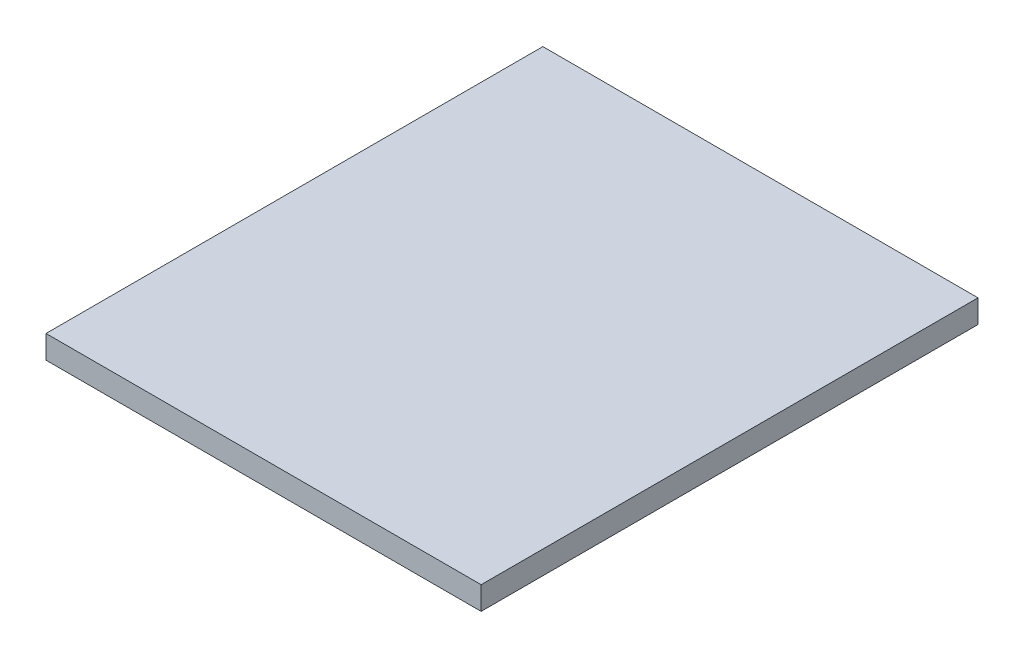
ISO-10303-21;
HEADER;
FILE_DESCRIPTION(('STEP AP214'),'2;1');
FILE_NAME('part.step','',(''),(''),'','','');
FILE_SCHEMA(('AUTOMOTIVE_DESIGN { 1 0 10303 214 1 1 1 1 }'));
ENDSEC;
DATA;
#1=APPLICATION_CONTEXT('core data for automotive mechanical design processes');
#2=APPLICATION_PROTOCOL_DEFINITION('international standard','automotive_design',2000,#1);
#3=PRODUCT_CONTEXT('',#1,'mechanical');
#4=PRODUCT('Part','Part','',(#3));
#5=PRODUCT_RELATED_PRODUCT_CATEGORY('part','',(#4));
#6=PRODUCT_DEFINITION_FORMATION('','',#4);
#7=PRODUCT_DEFINITION_CONTEXT('part definition',#1,'design');
#8=PRODUCT_DEFINITION('design','',#6,#7);
#9=PRODUCT_DEFINITION_SHAPE('','',#8);
#10=(LENGTH_UNIT() NAMED_UNIT(*) SI_UNIT(.MILLI.,.METRE.));
#11=(NAMED_UNIT(*) PLANE_ANGLE_UNIT() SI_UNIT($,.RADIAN.));
#12=(NAMED_UNIT(*) SI_UNIT($,.STERADIAN.) SOLID_ANGLE_UNIT());
#13=UNCERTAINTY_MEASURE_WITH_UNIT(LENGTH_MEASURE(1.E-05),#10,'distance_accuracy_value','');
#14=(GEOMETRIC_REPRESENTATION_CONTEXT(3) GLOBAL_UNCERTAINTY_ASSIGNED_CONTEXT((#13)) GLOBAL_UNIT_ASSIGNED_CONTEXT((#10,
#11,#12)) REPRESENTATION_CONTEXT('',''));
#15=CARTESIAN_POINT('',(0.,0.,0.));
#16=DIRECTION('',(0.,0.,1.));
#17=DIRECTION('',(1.,0.,0.));
#18=AXIS2_PLACEMENT_3D('',#15,#16,#17);
#19=CARTESIAN_POINT('',(0.,1.5,0.));
#20=DIRECTION('',(1.,0.,0.));
#21=DIRECTION('',(0.,0.,-1.));
#22=AXIS2_PLACEMENT_3D('',#19,#20,#21);
#23=PLANE('',#22);
#24=DIRECTION('',(0.,0.,1.));
#25=VECTOR('',#24,1.);
#26=CARTESIAN_POINT('',(0.,0.,0.));
#27=LINE('',#26,#25);
#28=CARTESIAN_POINT('',(0.,0.,-32.2));
#29=VERTEX_POINT('',#28);
#30=CARTESIAN_POINT('',(0.,0.,0.));
#31=VERTEX_POINT('',#30);
#32=EDGE_CURVE('E100',#29,#31,#27,.T.);
#33=ORIENTED_EDGE('',*,*,#32,.T.);
#34=DIRECTION('',(0.,-1.,0.));
#35=VECTOR('',#34,1.);
#36=CARTESIAN_POINT('',(0.,1.5,0.));
#37=LINE('',#36,#35);
#38=CARTESIAN_POINT('',(0.,1.5,0.));
#39=VERTEX_POINT('',#38);
#40=EDGE_CURVE('E11',#39,#31,#37,.T.);
#41=ORIENTED_EDGE('',*,*,#40,.F.);
#42=DIRECTION('',(0.,0.,1.));
#43=VECTOR('',#42,1.);
#44=CARTESIAN_POINT('',(0.,1.5,0.));
#45=LINE('',#44,#43);
#46=CARTESIAN_POINT('',(0.,1.5,-32.2));
#47=VERTEX_POINT('',#46);
#48=EDGE_CURVE('E88',#47,#39,#45,.T.);
#49=ORIENTED_EDGE('',*,*,#48,.F.);
#50=DIRECTION('',(0.,-1.,0.));
#51=VECTOR('',#50,1.);
#52=CARTESIAN_POINT('',(0.,1.5,-32.2));
#53=LINE('',#52,#51);
#54=EDGE_CURVE('E96',#47,#29,#53,.T.);
#55=ORIENTED_EDGE('',*,*,#54,.T.);
#56=EDGE_LOOP('',(#33,#41,#49,#55));
#57=FACE_BOUND('',#56,.T.);
#58=ADVANCED_FACE('F37',(#57),#23,.F.);
#59=CARTESIAN_POINT('',(0.,1.5,0.));
#60=DIRECTION('',(0.,0.,-1.));
#61=DIRECTION('',(-1.,0.,0.));
#62=AXIS2_PLACEMENT_3D('',#59,#60,#61);
#63=PLANE('',#62);
#64=DIRECTION('',(1.,0.,0.));
#65=VECTOR('',#64,1.);
#66=CARTESIAN_POINT('',(0.,0.,0.));
#67=LINE('',#66,#65);
#68=CARTESIAN_POINT('',(28.2,0.,0.));
#69=VERTEX_POINT('',#68);
#70=EDGE_CURVE('E92',#31,#69,#67,.T.);
#71=ORIENTED_EDGE('',*,*,#70,.T.);
#72=DIRECTION('',(0.,-1.,0.));
#73=VECTOR('',#72,1.);
#74=CARTESIAN_POINT('',(28.2,1.5,0.));
#75=LINE('',#74,#73);
#76=CARTESIAN_POINT('',(28.2,1.5,0.));
#77=VERTEX_POINT('',#76);
#78=EDGE_CURVE('E45',#77,#69,#75,.T.);
#79=ORIENTED_EDGE('',*,*,#78,.F.);
#80=DIRECTION('',(1.,0.,0.));
#81=VECTOR('',#80,1.);
#82=CARTESIAN_POINT('',(0.,1.5,0.));
#83=LINE('',#82,#81);
#84=EDGE_CURVE('E83',#39,#77,#83,.T.);
#85=ORIENTED_EDGE('',*,*,#84,.F.);
#86=ORIENTED_EDGE('',*,*,#40,.T.);
#87=EDGE_LOOP('',(#71,#79,#85,#86));
#88=FACE_BOUND('',#87,.T.);
#89=ADVANCED_FACE('F91',(#88),#63,.F.);
#90=CARTESIAN_POINT('',(28.2,1.5,0.));
#91=DIRECTION('',(-1.,0.,0.));
#92=DIRECTION('',(0.,0.,1.));
#93=AXIS2_PLACEMENT_3D('',#90,#91,#92);
#94=PLANE('',#93);
#95=DIRECTION('',(0.,0.,-1.));
#96=VECTOR('',#95,1.);
#97=CARTESIAN_POINT('',(28.2,0.,0.));
#98=LINE('',#97,#96);
#99=CARTESIAN_POINT('',(28.2,0.,-32.2));
#100=VERTEX_POINT('',#99);
#101=EDGE_CURVE('E70',#69,#100,#98,.T.);
#102=ORIENTED_EDGE('',*,*,#101,.T.);
#103=DIRECTION('',(0.,-1.,0.));
#104=VECTOR('',#103,1.);
#105=CARTESIAN_POINT('',(28.2,1.5,-32.2));
#106=LINE('',#105,#104);
#107=CARTESIAN_POINT('',(28.2,1.5,-32.2));
#108=VERTEX_POINT('',#107);
#109=EDGE_CURVE('E93',#108,#100,#106,.T.);
#110=ORIENTED_EDGE('',*,*,#109,.F.);
#111=DIRECTION('',(0.,0.,-1.));
#112=VECTOR('',#111,1.);
#113=CARTESIAN_POINT('',(28.2,1.5,0.));
#114=LINE('',#113,#112);
#115=EDGE_CURVE('E86',#77,#108,#114,.T.);
#116=ORIENTED_EDGE('',*,*,#115,.F.);
#117=ORIENTED_EDGE('',*,*,#78,.T.);
#118=EDGE_LOOP('',(#102,#110,#116,#117));
#119=FACE_BOUND('',#118,.T.);
#120=ADVANCED_FACE('F94',(#119),#94,.F.);
#121=CARTESIAN_POINT('',(0.,1.5,-32.2));
#122=DIRECTION('',(0.,0.,1.));
#123=DIRECTION('',(1.,0.,0.));
#124=AXIS2_PLACEMENT_3D('',#121,#122,#123);
#125=PLANE('',#124);
#126=DIRECTION('',(-1.,0.,0.));
#127=VECTOR('',#126,1.);
#128=CARTESIAN_POINT('',(0.,0.,-32.2));
#129=LINE('',#128,#127);
#130=EDGE_CURVE('E76',#100,#29,#129,.T.);
#131=ORIENTED_EDGE('',*,*,#130,.T.);
#132=ORIENTED_EDGE('',*,*,#54,.F.);
#133=DIRECTION('',(-1.,0.,0.));
#134=VECTOR('',#133,1.);
#135=CARTESIAN_POINT('',(0.,1.5,-32.2));
#136=LINE('',#135,#134);
#137=EDGE_CURVE('E53',#108,#47,#136,.T.);
#138=ORIENTED_EDGE('',*,*,#137,.F.);
#139=ORIENTED_EDGE('',*,*,#109,.T.);
#140=EDGE_LOOP('',(#131,#132,#138,#139));
#141=FACE_BOUND('',#140,.T.);
#142=ADVANCED_FACE('F107',(#141),#125,.F.);
#143=CARTESIAN_POINT('',(0.,1.5,0.));
#144=DIRECTION('',(0.,-1.,0.));
#145=DIRECTION('',(0.,0.,-1.));
#146=AXIS2_PLACEMENT_3D('',#143,#144,#145);
#147=PLANE('',#146);
#148=ORIENTED_EDGE('',*,*,#48,.T.);
#149=ORIENTED_EDGE('',*,*,#84,.T.);
#150=ORIENTED_EDGE('',*,*,#115,.T.);
#151=ORIENTED_EDGE('',*,*,#137,.T.);
#152=EDGE_LOOP('',(#148,#149,#150,#151));
#153=FACE_BOUND('',#152,.T.);
#154=ADVANCED_FACE('F84',(#153),#147,.F.);
#155=CARTESIAN_POINT('',(0.,0.,0.));
#156=DIRECTION('',(0.,-1.,0.));
#157=DIRECTION('',(0.,0.,-1.));
#158=AXIS2_PLACEMENT_3D('',#155,#156,#157);
#159=PLANE('',#158);
#160=ORIENTED_EDGE('',*,*,#32,.F.);
#161=ORIENTED_EDGE('',*,*,#130,.F.);
#162=ORIENTED_EDGE('',*,*,#101,.F.);
#163=ORIENTED_EDGE('',*,*,#70,.F.);
#164=EDGE_LOOP('',(#160,#161,#162,#163));
#165=FACE_BOUND('',#164,.T.);
#166=ADVANCED_FACE('F110',(#165),#159,.T.);
#167=CLOSED_SHELL('',(#58,#89,#120,#142,#154,#166));
#168=MANIFOLD_SOLID_BREP('B2',#167);
#169=ADVANCED_BREP_SHAPE_REPRESENTATION('',(#18,#168),#14);
#170=SHAPE_DEFINITION_REPRESENTATION(#9,#169);
ENDSEC;
END-ISO-10303-21;
